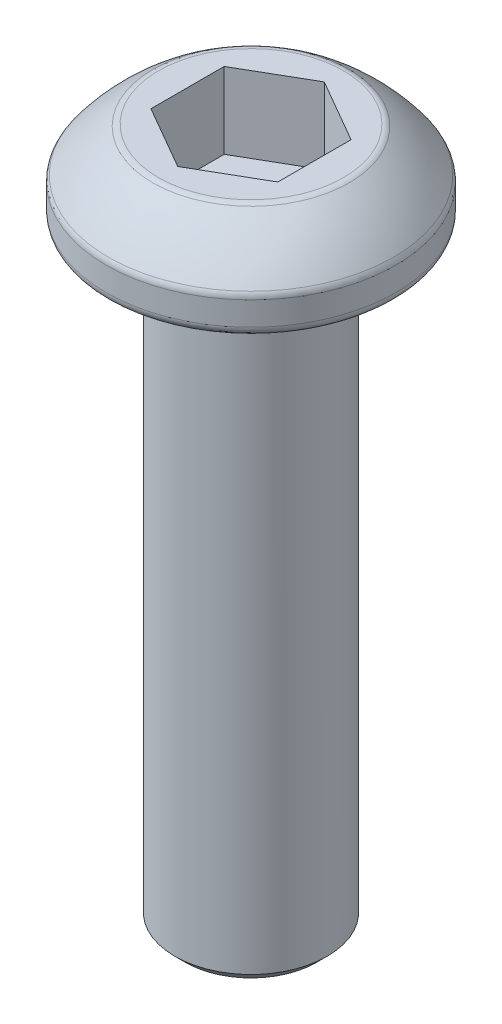
ISO-10303-21;
HEADER;
FILE_DESCRIPTION(('STEP AP214'),'2;1');
FILE_NAME('part.step','',(''),(''),'','','');
FILE_SCHEMA(('AUTOMOTIVE_DESIGN { 1 0 10303 214 1 1 1 1 }'));
ENDSEC;
DATA;
#1=APPLICATION_CONTEXT('core data for automotive mechanical design processes');
#2=APPLICATION_PROTOCOL_DEFINITION('international standard','automotive_design',2000,#1);
#3=PRODUCT_CONTEXT('',#1,'mechanical');
#4=PRODUCT('Part','Part','',(#3));
#5=PRODUCT_RELATED_PRODUCT_CATEGORY('part','',(#4));
#6=PRODUCT_DEFINITION_FORMATION('','',#4);
#7=PRODUCT_DEFINITION_CONTEXT('part definition',#1,'design');
#8=PRODUCT_DEFINITION('design','',#6,#7);
#9=PRODUCT_DEFINITION_SHAPE('','',#8);
#10=(LENGTH_UNIT() NAMED_UNIT(*) SI_UNIT(.MILLI.,.METRE.));
#11=(NAMED_UNIT(*) PLANE_ANGLE_UNIT() SI_UNIT($,.RADIAN.));
#12=(NAMED_UNIT(*) SI_UNIT($,.STERADIAN.) SOLID_ANGLE_UNIT());
#13=UNCERTAINTY_MEASURE_WITH_UNIT(LENGTH_MEASURE(1.E-05),#10,'distance_accuracy_value','');
#14=(GEOMETRIC_REPRESENTATION_CONTEXT(3) GLOBAL_UNCERTAINTY_ASSIGNED_CONTEXT((#13)) GLOBAL_UNIT_ASSIGNED_CONTEXT((#10,
#11,#12)) REPRESENTATION_CONTEXT('',''));
#15=CARTESIAN_POINT('',(0.,0.,0.));
#16=DIRECTION('',(0.,0.,1.));
#17=DIRECTION('',(1.,0.,0.));
#18=AXIS2_PLACEMENT_3D('',#15,#16,#17);
#19=CARTESIAN_POINT('',(0.,60.1595545799248,0.));
#20=DIRECTION('',(0.,1.,0.));
#21=DIRECTION('',(0.,0.,1.));
#22=AXIS2_PLACEMENT_3D('',#19,#20,#21);
#23=CYLINDRICAL_SURFACE('',#22,2.85);
#24=CARTESIAN_POINT('',(0.,0.666596043929719,0.));
#25=DIRECTION('',(0.,-1.,0.));
#26=DIRECTION('',(0.,0.,-1.));
#27=AXIS2_PLACEMENT_3D('',#24,#25,#26);
#28=CIRCLE('',#27,2.85);
#29=CARTESIAN_POINT('',(0.,0.666596043929719,-2.85));
#30=VERTEX_POINT('',#29);
#31=EDGE_CURVE('E11',#30,#30,#28,.T.);
#32=ORIENTED_EDGE('',*,*,#31,.T.);
#33=EDGE_LOOP('',(#32));
#34=FACE_BOUND('',#33,.T.);
#35=CARTESIAN_POINT('',(0.,0.2,0.));
#36=DIRECTION('',(0.,-1.,0.));
#37=DIRECTION('',(0.,0.,-1.));
#38=AXIS2_PLACEMENT_3D('',#35,#36,#37);
#39=CIRCLE('',#38,2.85);
#40=CARTESIAN_POINT('',(0.,0.2,-2.85));
#41=VERTEX_POINT('',#40);
#42=EDGE_CURVE('E127',#41,#41,#39,.F.);
#43=ORIENTED_EDGE('',*,*,#42,.T.);
#44=EDGE_LOOP('',(#43));
#45=FACE_BOUND('',#44,.T.);
#46=ADVANCED_FACE('F17',(#34,#45),#23,.T.);
#47=CARTESIAN_POINT('',(-1.5,0.,0.));
#48=DIRECTION('',(0.,-1.,0.));
#49=DIRECTION('',(0.,0.,-1.));
#50=AXIS2_PLACEMENT_3D('',#47,#48,#49);
#51=PLANE('',#50);
#52=CARTESIAN_POINT('',(0.,0.,0.));
#53=DIRECTION('',(0.,-1.,0.));
#54=DIRECTION('',(0.,0.,-1.));
#55=AXIS2_PLACEMENT_3D('',#52,#53,#54);
#56=CIRCLE('',#55,2.65);
#57=CARTESIAN_POINT('',(0.,0.,-2.65));
#58=VERTEX_POINT('',#57);
#59=EDGE_CURVE('E130',#58,#58,#56,.T.);
#60=ORIENTED_EDGE('',*,*,#59,.T.);
#61=EDGE_LOOP('',(#60));
#62=FACE_BOUND('',#61,.T.);
#63=CARTESIAN_POINT('',(0.,0.,0.));
#64=DIRECTION('',(0.,1.,0.));
#65=DIRECTION('',(0.,0.,1.));
#66=AXIS2_PLACEMENT_3D('',#63,#64,#65);
#67=CIRCLE('',#66,1.5);
#68=CARTESIAN_POINT('',(0.,0.,1.5));
#69=VERTEX_POINT('',#68);
#70=EDGE_CURVE('E119',#69,#69,#67,.T.);
#71=ORIENTED_EDGE('',*,*,#70,.T.);
#72=EDGE_LOOP('',(#71));
#73=FACE_BOUND('',#72,.T.);
#74=ADVANCED_FACE('F170',(#62,#73),#51,.T.);
#75=CARTESIAN_POINT('',(0.,60.1595545799248,0.));
#76=DIRECTION('',(0.,1.,0.));
#77=DIRECTION('',(0.,0.,1.));
#78=AXIS2_PLACEMENT_3D('',#75,#76,#77);
#79=CYLINDRICAL_SURFACE('',#78,1.5);
#80=CARTESIAN_POINT('',(0.,-11.8,0.));
#81=DIRECTION('',(0.,-1.,0.));
#82=DIRECTION('',(0.,0.,-1.));
#83=AXIS2_PLACEMENT_3D('',#80,#81,#82);
#84=CIRCLE('',#83,1.5);
#85=CARTESIAN_POINT('',(0.,-11.8,-1.5));
#86=VERTEX_POINT('',#85);
#87=EDGE_CURVE('E133',#86,#86,#84,.F.);
#88=ORIENTED_EDGE('',*,*,#87,.T.);
#89=EDGE_LOOP('',(#88));
#90=FACE_BOUND('',#89,.T.);
#91=ORIENTED_EDGE('',*,*,#70,.F.);
#92=EDGE_LOOP('',(#91));
#93=FACE_BOUND('',#92,.T.);
#94=ADVANCED_FACE('F177',(#90,#93),#79,.T.);
#95=CARTESIAN_POINT('',(0.,-12.,0.));
#96=DIRECTION('',(0.,-1.,0.));
#97=DIRECTION('',(0.,0.,-1.));
#98=AXIS2_PLACEMENT_3D('',#95,#96,#97);
#99=PLANE('',#98);
#100=CARTESIAN_POINT('',(0.,-12.,0.));
#101=DIRECTION('',(0.,-1.,0.));
#102=DIRECTION('',(0.,0.,-1.));
#103=AXIS2_PLACEMENT_3D('',#100,#101,#102);
#104=CIRCLE('',#103,1.29999999999998);
#105=CARTESIAN_POINT('',(0.,-12.,-1.29999999999998));
#106=VERTEX_POINT('',#105);
#107=EDGE_CURVE('E136',#106,#106,#104,.T.);
#108=ORIENTED_EDGE('',*,*,#107,.T.);
#109=EDGE_LOOP('',(#108));
#110=FACE_BOUND('',#109,.T.);
#111=ADVANCED_FACE('F189',(#110),#99,.T.);
#112=CARTESIAN_POINT('',(0.,0.2,0.));
#113=DIRECTION('',(0.,-1.,0.));
#114=DIRECTION('',(0.,0.,-1.));
#115=AXIS2_PLACEMENT_3D('',#112,#113,#114);
#116=TOROIDAL_SURFACE('',#115,2.65,0.2);
#117=ORIENTED_EDGE('',*,*,#59,.F.);
#118=EDGE_LOOP('',(#117));
#119=FACE_BOUND('',#118,.T.);
#120=ORIENTED_EDGE('',*,*,#42,.F.);
#121=EDGE_LOOP('',(#120));
#122=FACE_BOUND('',#121,.T.);
#123=ADVANCED_FACE('F186',(#119,#122),#116,.T.);
#124=CARTESIAN_POINT('',(0.,-11.8,0.));
#125=DIRECTION('',(0.,1.,0.));
#126=DIRECTION('',(0.,0.,1.));
#127=AXIS2_PLACEMENT_3D('',#124,#125,#126);
#128=CONICAL_SURFACE('',#127,1.5,0.78539816339745);
#129=ORIENTED_EDGE('',*,*,#107,.F.);
#130=EDGE_LOOP('',(#129));
#131=FACE_BOUND('',#130,.T.);
#132=ORIENTED_EDGE('',*,*,#87,.F.);
#133=EDGE_LOOP('',(#132));
#134=FACE_BOUND('',#133,.T.);
#135=ADVANCED_FACE('F158',(#131,#134),#128,.T.);
#136=CARTESIAN_POINT('',(0.,-1.3,0.));
#137=DIRECTION('',(0.,1.,0.));
#138=DIRECTION('',(-1.,0.,0.));
#139=AXIS2_PLACEMENT_3D('',#136,#137,#138);
#140=SPHERICAL_SURFACE('',#139,3.5);
#141=CARTESIAN_POINT('',(0.,1.61666666666667,0.));
#142=DIRECTION('',(0.,-1.,0.));
#143=DIRECTION('',(0.,0.,-1.));
#144=AXIS2_PLACEMENT_3D('',#141,#142,#143);
#145=CIRCLE('',#144,1.93469779437398);
#146=CARTESIAN_POINT('',(-1.93469779437399,1.61666666666667,0.));
#147=VERTEX_POINT('',#146);
#148=EDGE_CURVE('E142',#147,#147,#145,.T.);
#149=CARTESIAN_POINT('',(0.,0.785783682955765,0.));
#150=DIRECTION('',(0.,-1.,0.));
#151=DIRECTION('',(0.,0.,-1.));
#152=AXIS2_PLACEMENT_3D('',#149,#150,#151);
#153=CIRCLE('',#152,2.81060606060606);
#154=CARTESIAN_POINT('',(-2.81060606060605,0.785783682955765,0.));
#155=VERTEX_POINT('',#154);
#156=EDGE_CURVE('E139',#155,#155,#153,.F.);
#157=CARTESIAN_POINT('',(-1.93469779437399,1.61666666666667,0.));
#158=CARTESIAN_POINT('',(-1.94523052712988,1.60968004561565,0.));
#159=CARTESIAN_POINT('',(-1.9557254113343,1.60263636582437,0.));
#160=CARTESIAN_POINT('',(-1.97663825800548,1.58843572594383,0.));
#161=CARTESIAN_POINT('',(-1.98705622047225,1.58127876585458,0.));
#162=CARTESIAN_POINT('',(-2.00781399903341,1.56685240256066,0.));
#163=CARTESIAN_POINT('',(-2.0181538151278,1.559582999356,0.));
#164=CARTESIAN_POINT('',(-2.0387540879004,1.54493260377344,0.));
#165=CARTESIAN_POINT('',(-2.0490145445786,1.53755161139555,0.));
#166=CARTESIAN_POINT('',(-2.06945489414099,1.52267890355106,0.));
#167=CARTESIAN_POINT('',(-2.07963478702517,1.51518718808446,0.));
#168=CARTESIAN_POINT('',(-2.09991281425093,1.5000939133981,0.));
#169=CARTESIAN_POINT('',(-2.11001094859251,1.49249235417834,0.));
#170=CARTESIAN_POINT('',(-2.13012427353369,1.47718028414474,0.));
#171=CARTESIAN_POINT('',(-2.14013946413329,1.4694697733309,0.));
#172=CARTESIAN_POINT('',(-2.1600857261385,1.4539407050739,0.));
#173=CARTESIAN_POINT('',(-2.17001679754411,1.44612214763075,0.));
#174=CARTESIAN_POINT('',(-2.1897936555788,1.43037790375611,0.));
#175=CARTESIAN_POINT('',(-2.19963944220789,1.42245221732462,0.));
#176=CARTESIAN_POINT('',(-2.21924457511753,1.40649464568905,0.));
#177=CARTESIAN_POINT('',(-2.22900392139809,1.39846276048496,0.));
#178=CARTESIAN_POINT('',(-2.24843502818371,1.3822937339838,0.));
#179=CARTESIAN_POINT('',(-2.25810678868877,1.37415659268674,0.));
#180=CARTESIAN_POINT('',(-2.27736158877615,1.35777800903296,0.));
#181=CARTESIAN_POINT('',(-2.28694462835848,1.34953656667624,0.));
#182=CARTESIAN_POINT('',(-2.3060208618661,1.33295034817798,0.));
#183=CARTESIAN_POINT('',(-2.31551405579139,1.32460557203644,0.));
#184=CARTESIAN_POINT('',(-2.33440948379555,1.30781366537136,0.));
#185=CARTESIAN_POINT('',(-2.34381171787442,1.29936653484782,0.));
#186=CARTESIAN_POINT('',(-2.36252412267206,1.28237091083462,0.));
#187=CARTESIAN_POINT('',(-2.37183429339084,1.27382241734495,0.));
#188=CARTESIAN_POINT('',(-2.39036147875982,1.25662507071205,0.));
#189=CARTESIAN_POINT('',(-2.39957849341004,1.24797621756881,0.));
#190=CARTESIAN_POINT('',(-2.41791828486691,1.23057916672024,0.));
#191=CARTESIAN_POINT('',(-2.42704106167356,1.22183096901491,0.));
#192=CARTESIAN_POINT('',(-2.44519130672875,1.20423625579344,0.));
#193=CARTESIAN_POINT('',(-2.45421877497729,1.1953897402773,0.));
#194=CARTESIAN_POINT('',(-2.47217734338775,1.17759942972477,0.));
#195=CARTESIAN_POINT('',(-2.48110844354969,1.16865563468837,0.));
#196=CARTESIAN_POINT('',(-2.49887322756895,1.15067181480331,0.));
#197=CARTESIAN_POINT('',(-2.50770691142627,1.14163178995465,0.));
#198=CARTESIAN_POINT('',(-2.52527582605175,1.12345657144725,0.));
#199=CARTESIAN_POINT('',(-2.53401105681991,1.11432137778852,0.));
#200=CARTESIAN_POINT('',(-2.55138204003769,1.09595689383288,0.));
#201=CARTESIAN_POINT('',(-2.56001779248732,1.08672760353599,0.));
#202=CARTESIAN_POINT('',(-2.57718880551411,1.06817600951976,0.));
#203=CARTESIAN_POINT('',(-2.58572406609128,1.05885370580044,0.));
#204=CARTESIAN_POINT('',(-2.6026930936138,1.0401171790719,0.));
#205=CARTESIAN_POINT('',(-2.61112686055914,1.03070295606268,0.));
#206=CARTESIAN_POINT('',(-2.62789191097032,1.01178369567493,0.));
#207=CARTESIAN_POINT('',(-2.63622319443615,1.00227865829641,0.));
#208=CARTESIAN_POINT('',(-2.65278230007006,0.983178884750212,0.));
#209=CARTESIAN_POINT('',(-2.66101012223815,0.973584148582545,0.));
#210=CARTESIAN_POINT('',(-2.67736133959657,0.954306103562343,0.));
#211=CARTESIAN_POINT('',(-2.6854847347869,0.944622794709807,0.));
#212=CARTESIAN_POINT('',(-2.70162614478381,0.925168740833083,0.));
#213=CARTESIAN_POINT('',(-2.70964415959037,0.915397995808895,0.));
#214=CARTESIAN_POINT('',(-2.72557386771592,0.895770216314132,0.));
#215=CARTESIAN_POINT('',(-2.73348556103491,0.885913181843557,0.));
#216=CARTESIAN_POINT('',(-2.7492016978064,0.866113980495762,0.));
#217=CARTESIAN_POINT('',(-2.7570061412589,0.856171813618541,0.));
#218=CARTESIAN_POINT('',(-2.7725068615871,0.836203513791331,0.));
#219=CARTESIAN_POINT('',(-2.78020313846278,0.826177380841341,0.));
#220=CARTESIAN_POINT('',(-2.79548662505218,0.806042327660861,0.));
#221=CARTESIAN_POINT('',(-2.8030738347659,0.795933407430371,0.));
#222=CARTESIAN_POINT('',(-2.81060606060605,0.785783682955765,0.));
#223=B_SPLINE_CURVE_WITH_KNOTS('',3,(#157,#158,#159,#160,#161,#162,#163,#164,#165,#166,#167,
#168,#169,#170,#171,#172,#173,#174,#175,#176,#177,#178,#179,#180,#181,#182,#183,#184,#185,#186,
#187,#188,#189,#190,#191,#192,#193,#194,#195,#196,#197,#198,#199,#200,#201,#202,#203,#204,#205,
#206,#207,#208,#209,#210,#211,#212,#213,#214,#215,#216,#217,#218,#219,#220,#221,#222),
.UNSPECIFIED.,.F.,.F.,(4,2,2,2,2,2,2,2,2,2,2,2,2,2,2,2,2,2,2,2,2,2,2,2,2,2,2,2,2,2,2,2,4),(0.,
0.0379176466570755,0.0758352933141507,0.113752939971226,0.151670586628302,0.189588233285377,
0.227505879942452,0.265423526599527,0.303341173256603,0.341258819913678,0.379176466570754,
0.417094113227829,0.455011759884904,0.49292940654198,0.530847053199055,0.568764699856131,
0.606682346513206,0.644599993170282,0.682517639827357,0.720435286484432,0.758352933141508,
0.796270579798584,0.834188226455659,0.872105873112734,0.910023519769809,0.947941166426885,
0.985858813083961,1.02377645974104,1.06169410639811,1.09961175305519,1.13752939971226,
1.17544704636934,1.21336469302641),.UNSPECIFIED.);
#224=EDGE_CURVE('BSEAM155',#147,#155,#223,.T.);
#225=ORIENTED_EDGE('',*,*,#148,.T.);
#226=ORIENTED_EDGE('',*,*,#156,.T.);
#227=ORIENTED_EDGE('',*,*,#224,.T.);
#228=ORIENTED_EDGE('',*,*,#224,.F.);
#229=EDGE_LOOP('',(#225,#227,#226,#228));
#230=FACE_BOUND('',#229,.T.);
#231=ADVANCED_FACE('F155',(#230),#140,.T.);
#232=CARTESIAN_POINT('',(0.,0.15,0.));
#233=DIRECTION('',(0.,1.,0.));
#234=DIRECTION('',(0.,0.,1.));
#235=AXIS2_PLACEMENT_3D('',#232,#233,#234);
#236=PLANE('',#235);
#237=DIRECTION('',(-0.866025403784439,0.,0.5));
#238=VECTOR('',#237,1.);
#239=CARTESIAN_POINT('',(0.,0.15,-1.44337567297406));
#240=LINE('',#239,#238);
#241=CARTESIAN_POINT('',(0.,0.15,-1.44337567297406));
#242=VERTEX_POINT('',#241);
#243=CARTESIAN_POINT('',(-1.25,0.15,-0.721687836487032));
#244=VERTEX_POINT('',#243);
#245=EDGE_CURVE('E117',#242,#244,#240,.T.);
#246=ORIENTED_EDGE('',*,*,#245,.T.);
#247=DIRECTION('',(0.,0.,1.));
#248=VECTOR('',#247,1.);
#249=CARTESIAN_POINT('',(-1.25,0.15,-0.721687836487032));
#250=LINE('',#249,#248);
#251=CARTESIAN_POINT('',(-1.25,0.15,0.721687836487032));
#252=VERTEX_POINT('',#251);
#253=EDGE_CURVE('E100',#244,#252,#250,.T.);
#254=ORIENTED_EDGE('',*,*,#253,.T.);
#255=DIRECTION('',(0.866025403784439,0.,0.5));
#256=VECTOR('',#255,1.);
#257=CARTESIAN_POINT('',(-1.25,0.15,0.721687836487032));
#258=LINE('',#257,#256);
#259=CARTESIAN_POINT('',(0.,0.15,1.44337567297406));
#260=VERTEX_POINT('',#259);
#261=EDGE_CURVE('E98',#252,#260,#258,.T.);
#262=ORIENTED_EDGE('',*,*,#261,.T.);
#263=DIRECTION('',(0.866025403784439,0.,-0.5));
#264=VECTOR('',#263,1.);
#265=CARTESIAN_POINT('',(0.,0.15,1.44337567297406));
#266=LINE('',#265,#264);
#267=CARTESIAN_POINT('',(1.25,0.15,0.721687836487032));
#268=VERTEX_POINT('',#267);
#269=EDGE_CURVE('E77',#260,#268,#266,.T.);
#270=ORIENTED_EDGE('',*,*,#269,.T.);
#271=DIRECTION('',(0.,0.,-1.));
#272=VECTOR('',#271,1.);
#273=CARTESIAN_POINT('',(1.25,0.15,0.721687836487032));
#274=LINE('',#273,#272);
#275=CARTESIAN_POINT('',(1.25,0.15,-0.721687836487032));
#276=VERTEX_POINT('',#275);
#277=EDGE_CURVE('E88',#268,#276,#274,.T.);
#278=ORIENTED_EDGE('',*,*,#277,.T.);
#279=DIRECTION('',(-0.866025403784439,0.,-0.5));
#280=VECTOR('',#279,1.);
#281=CARTESIAN_POINT('',(1.25,0.15,-0.721687836487032));
#282=LINE('',#281,#280);
#283=EDGE_CURVE('E92',#276,#242,#282,.T.);
#284=ORIENTED_EDGE('',*,*,#283,.T.);
#285=EDGE_LOOP('',(#246,#254,#262,#270,#278,#284));
#286=FACE_BOUND('',#285,.T.);
#287=ADVANCED_FACE('F95',(#286),#236,.T.);
#288=CARTESIAN_POINT('',(-1.25,0.15,-0.721687836487032));
#289=DIRECTION('',(-1.,0.,0.));
#290=DIRECTION('',(0.,0.,1.));
#291=AXIS2_PLACEMENT_3D('',#288,#289,#290);
#292=PLANE('',#291);
#293=DIRECTION('',(0.,0.,1.));
#294=VECTOR('',#293,1.);
#295=CARTESIAN_POINT('',(-1.25,1.65,-0.721687836487032));
#296=LINE('',#295,#294);
#297=CARTESIAN_POINT('',(-1.25,1.65,-0.721687836487032));
#298=VERTEX_POINT('',#297);
#299=CARTESIAN_POINT('',(-1.25,1.65,0.721687836487032));
#300=VERTEX_POINT('',#299);
#301=EDGE_CURVE('E106',#298,#300,#296,.T.);
#302=ORIENTED_EDGE('',*,*,#301,.T.);
#303=DIRECTION('',(0.,1.,0.));
#304=VECTOR('',#303,1.);
#305=CARTESIAN_POINT('',(-1.25,0.15,0.721687836487032));
#306=LINE('',#305,#304);
#307=EDGE_CURVE('E122',#252,#300,#306,.T.);
#308=ORIENTED_EDGE('',*,*,#307,.F.);
#309=ORIENTED_EDGE('',*,*,#253,.F.);
#310=DIRECTION('',(0.,1.,0.));
#311=VECTOR('',#310,1.);
#312=CARTESIAN_POINT('',(-1.25,0.15,-0.721687836487032));
#313=LINE('',#312,#311);
#314=EDGE_CURVE('E62',#244,#298,#313,.T.);
#315=ORIENTED_EDGE('',*,*,#314,.T.);
#316=EDGE_LOOP('',(#302,#308,#309,#315));
#317=FACE_BOUND('',#316,.T.);
#318=ADVANCED_FACE('F214',(#317),#292,.F.);
#319=CARTESIAN_POINT('',(-1.25,0.15,0.721687836487032));
#320=DIRECTION('',(-0.5,0.,0.866025403784439));
#321=DIRECTION('',(0.866025403784439,0.,0.5));
#322=AXIS2_PLACEMENT_3D('',#319,#320,#321);
#323=PLANE('',#322);
#324=DIRECTION('',(0.866025403784439,0.,0.5));
#325=VECTOR('',#324,1.);
#326=CARTESIAN_POINT('',(-1.25,1.65,0.721687836487032));
#327=LINE('',#326,#325);
#328=CARTESIAN_POINT('',(0.,1.65,1.44337567297406));
#329=VERTEX_POINT('',#328);
#330=EDGE_CURVE('E109',#300,#329,#327,.T.);
#331=ORIENTED_EDGE('',*,*,#330,.T.);
#332=DIRECTION('',(0.,1.,0.));
#333=VECTOR('',#332,1.);
#334=CARTESIAN_POINT('',(0.,0.15,1.44337567297406));
#335=LINE('',#334,#333);
#336=EDGE_CURVE('E85',#260,#329,#335,.T.);
#337=ORIENTED_EDGE('',*,*,#336,.F.);
#338=ORIENTED_EDGE('',*,*,#261,.F.);
#339=ORIENTED_EDGE('',*,*,#307,.T.);
#340=EDGE_LOOP('',(#331,#337,#338,#339));
#341=FACE_BOUND('',#340,.T.);
#342=ADVANCED_FACE('F217',(#341),#323,.F.);
#343=CARTESIAN_POINT('',(0.,0.15,1.44337567297406));
#344=DIRECTION('',(0.5,0.,0.866025403784438));
#345=DIRECTION('',(0.866025403784439,0.,-0.5));
#346=AXIS2_PLACEMENT_3D('',#343,#344,#345);
#347=PLANE('',#346);
#348=DIRECTION('',(0.866025403784439,0.,-0.5));
#349=VECTOR('',#348,1.);
#350=CARTESIAN_POINT('',(0.,1.65,1.44337567297406));
#351=LINE('',#350,#349);
#352=CARTESIAN_POINT('',(1.25,1.65,0.721687836487032));
#353=VERTEX_POINT('',#352);
#354=EDGE_CURVE('E80',#329,#353,#351,.T.);
#355=ORIENTED_EDGE('',*,*,#354,.T.);
#356=DIRECTION('',(0.,1.,0.));
#357=VECTOR('',#356,1.);
#358=CARTESIAN_POINT('',(1.25,0.15,0.721687836487032));
#359=LINE('',#358,#357);
#360=EDGE_CURVE('E73',#268,#353,#359,.T.);
#361=ORIENTED_EDGE('',*,*,#360,.F.);
#362=ORIENTED_EDGE('',*,*,#269,.F.);
#363=ORIENTED_EDGE('',*,*,#336,.T.);
#364=EDGE_LOOP('',(#355,#361,#362,#363));
#365=FACE_BOUND('',#364,.T.);
#366=ADVANCED_FACE('F75',(#365),#347,.F.);
#367=CARTESIAN_POINT('',(1.25,0.15,0.721687836487032));
#368=DIRECTION('',(1.,0.,0.));
#369=DIRECTION('',(0.,0.,-1.));
#370=AXIS2_PLACEMENT_3D('',#367,#368,#369);
#371=PLANE('',#370);
#372=DIRECTION('',(0.,0.,-1.));
#373=VECTOR('',#372,1.);
#374=CARTESIAN_POINT('',(1.25,1.65,0.721687836487032));
#375=LINE('',#374,#373);
#376=CARTESIAN_POINT('',(1.25,1.65,-0.721687836487032));
#377=VERTEX_POINT('',#376);
#378=EDGE_CURVE('E113',#353,#377,#375,.T.);
#379=ORIENTED_EDGE('',*,*,#378,.T.);
#380=DIRECTION('',(0.,1.,0.));
#381=VECTOR('',#380,1.);
#382=CARTESIAN_POINT('',(1.25,0.15,-0.721687836487032));
#383=LINE('',#382,#381);
#384=EDGE_CURVE('E84',#276,#377,#383,.T.);
#385=ORIENTED_EDGE('',*,*,#384,.F.);
#386=ORIENTED_EDGE('',*,*,#277,.F.);
#387=ORIENTED_EDGE('',*,*,#360,.T.);
#388=EDGE_LOOP('',(#379,#385,#386,#387));
#389=FACE_BOUND('',#388,.T.);
#390=ADVANCED_FACE('F89',(#389),#371,.F.);
#391=CARTESIAN_POINT('',(1.25,0.15,-0.721687836487032));
#392=DIRECTION('',(0.5,0.,-0.866025403784439));
#393=DIRECTION('',(-0.866025403784439,0.,-0.5));
#394=AXIS2_PLACEMENT_3D('',#391,#392,#393);
#395=PLANE('',#394);
#396=DIRECTION('',(-0.866025403784439,0.,-0.5));
#397=VECTOR('',#396,1.);
#398=CARTESIAN_POINT('',(1.25,1.65,-0.721687836487032));
#399=LINE('',#398,#397);
#400=CARTESIAN_POINT('',(0.,1.65,-1.44337567297406));
#401=VERTEX_POINT('',#400);
#402=EDGE_CURVE('E115',#377,#401,#399,.T.);
#403=ORIENTED_EDGE('',*,*,#402,.T.);
#404=DIRECTION('',(0.,1.,0.));
#405=VECTOR('',#404,1.);
#406=CARTESIAN_POINT('',(0.,0.15,-1.44337567297406));
#407=LINE('',#406,#405);
#408=EDGE_CURVE('E40',#242,#401,#407,.T.);
#409=ORIENTED_EDGE('',*,*,#408,.F.);
#410=ORIENTED_EDGE('',*,*,#283,.F.);
#411=ORIENTED_EDGE('',*,*,#384,.T.);
#412=EDGE_LOOP('',(#403,#409,#410,#411));
#413=FACE_BOUND('',#412,.T.);
#414=ADVANCED_FACE('F213',(#413),#395,.F.);
#415=CARTESIAN_POINT('',(0.,0.15,-1.44337567297406));
#416=DIRECTION('',(-0.5,0.,-0.866025403784439));
#417=DIRECTION('',(-0.866025403784439,0.,0.5));
#418=AXIS2_PLACEMENT_3D('',#415,#416,#417);
#419=PLANE('',#418);
#420=DIRECTION('',(-0.866025403784439,0.,0.5));
#421=VECTOR('',#420,1.);
#422=CARTESIAN_POINT('',(0.,1.65,-1.44337567297406));
#423=LINE('',#422,#421);
#424=EDGE_CURVE('E32',#401,#298,#423,.T.);
#425=ORIENTED_EDGE('',*,*,#424,.T.);
#426=ORIENTED_EDGE('',*,*,#314,.F.);
#427=ORIENTED_EDGE('',*,*,#245,.F.);
#428=ORIENTED_EDGE('',*,*,#408,.T.);
#429=EDGE_LOOP('',(#425,#426,#427,#428));
#430=FACE_BOUND('',#429,.T.);
#431=ADVANCED_FACE('F185',(#430),#419,.F.);
#432=CARTESIAN_POINT('',(0.,1.65,0.));
#433=DIRECTION('',(0.,1.,0.));
#434=DIRECTION('',(0.,0.,1.));
#435=AXIS2_PLACEMENT_3D('',#432,#433,#434);
#436=PLANE('',#435);
#437=CARTESIAN_POINT('',(0.,1.65,0.));
#438=DIRECTION('',(0.,1.,0.));
#439=DIRECTION('',(0.,0.,1.));
#440=AXIS2_PLACEMENT_3D('',#437,#438,#439);
#441=CIRCLE('',#440,1.82414363469547);
#442=CARTESIAN_POINT('',(0.,1.65,1.82414363469547));
#443=VERTEX_POINT('',#442);
#444=EDGE_CURVE('E25',#443,#443,#441,.T.);
#445=ORIENTED_EDGE('',*,*,#444,.T.);
#446=EDGE_LOOP('',(#445));
#447=FACE_BOUND('',#446,.T.);
#448=ORIENTED_EDGE('',*,*,#424,.F.);
#449=ORIENTED_EDGE('',*,*,#402,.F.);
#450=ORIENTED_EDGE('',*,*,#378,.F.);
#451=ORIENTED_EDGE('',*,*,#354,.F.);
#452=ORIENTED_EDGE('',*,*,#330,.F.);
#453=ORIENTED_EDGE('',*,*,#301,.F.);
#454=EDGE_LOOP('',(#448,#449,#450,#451,#452,#453));
#455=FACE_BOUND('',#454,.T.);
#456=ADVANCED_FACE('F147',(#447,#455),#436,.T.);
#457=CARTESIAN_POINT('',(0.,1.45,0.));
#458=DIRECTION('',(0.,1.,0.));
#459=DIRECTION('',(0.,0.,1.));
#460=AXIS2_PLACEMENT_3D('',#457,#458,#459);
#461=TOROIDAL_SURFACE('',#460,1.82414363469547,0.2);
#462=ORIENTED_EDGE('',*,*,#444,.F.);
#463=EDGE_LOOP('',(#462));
#464=FACE_BOUND('',#463,.T.);
#465=ORIENTED_EDGE('',*,*,#148,.F.);
#466=EDGE_LOOP('',(#465));
#467=FACE_BOUND('',#466,.T.);
#468=ADVANCED_FACE('F150',(#464,#467),#461,.T.);
#469=CARTESIAN_POINT('',(0.,0.666596043929721,0.));
#470=DIRECTION('',(0.,-1.,0.));
#471=DIRECTION('',(0.,0.,-1.));
#472=AXIS2_PLACEMENT_3D('',#469,#470,#471);
#473=TOROIDAL_SURFACE('',#472,2.65,0.2);
#474=ORIENTED_EDGE('',*,*,#31,.F.);
#475=EDGE_LOOP('',(#474));
#476=FACE_BOUND('',#475,.T.);
#477=ORIENTED_EDGE('',*,*,#156,.F.);
#478=EDGE_LOOP('',(#477));
#479=FACE_BOUND('',#478,.T.);
#480=ADVANCED_FACE('F19',(#476,#479),#473,.T.);
#481=CLOSED_SHELL('',(#46,#74,#94,#111,#123,#135,#231,#287,#318,#342,#366,#390,#414,#431,#456,
#468,#480));
#482=MANIFOLD_SOLID_BREP('B1',#481);
#483=ADVANCED_BREP_SHAPE_REPRESENTATION('',(#18,#482),#14);
#484=SHAPE_DEFINITION_REPRESENTATION(#9,#483);
ENDSEC;
END-ISO-10303-21;
